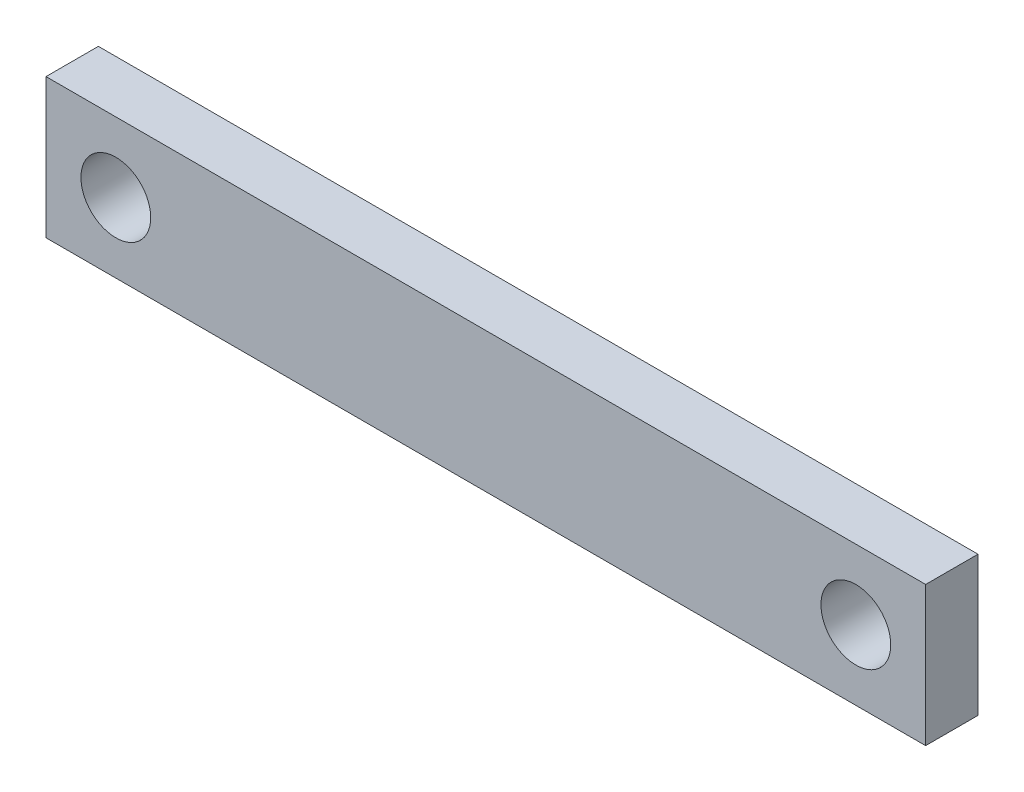
ISO-10303-21;
HEADER;
FILE_DESCRIPTION(('STEP AP214'),'2;1');
FILE_NAME('part.step','',(''),(''),'','','');
FILE_SCHEMA(('AUTOMOTIVE_DESIGN { 1 0 10303 214 1 1 1 1 }'));
ENDSEC;
DATA;
#1=APPLICATION_CONTEXT('core data for automotive mechanical design processes');
#2=APPLICATION_PROTOCOL_DEFINITION('international standard','automotive_design',2000,#1);
#3=PRODUCT_CONTEXT('',#1,'mechanical');
#4=PRODUCT('Part','Part','',(#3));
#5=PRODUCT_RELATED_PRODUCT_CATEGORY('part','',(#4));
#6=PRODUCT_DEFINITION_FORMATION('','',#4);
#7=PRODUCT_DEFINITION_CONTEXT('part definition',#1,'design');
#8=PRODUCT_DEFINITION('design','',#6,#7);
#9=PRODUCT_DEFINITION_SHAPE('','',#8);
#10=(LENGTH_UNIT() NAMED_UNIT(*) SI_UNIT(.MILLI.,.METRE.));
#11=(NAMED_UNIT(*) PLANE_ANGLE_UNIT() SI_UNIT($,.RADIAN.));
#12=(NAMED_UNIT(*) SI_UNIT($,.STERADIAN.) SOLID_ANGLE_UNIT());
#13=UNCERTAINTY_MEASURE_WITH_UNIT(LENGTH_MEASURE(1.E-05),#10,'distance_accuracy_value','');
#14=(GEOMETRIC_REPRESENTATION_CONTEXT(3) GLOBAL_UNCERTAINTY_ASSIGNED_CONTEXT((#13)) GLOBAL_UNIT_ASSIGNED_CONTEXT((#10,
#11,#12)) REPRESENTATION_CONTEXT('',''));
#15=CARTESIAN_POINT('',(0.,0.,0.));
#16=DIRECTION('',(0.,0.,1.));
#17=DIRECTION('',(1.,0.,0.));
#18=AXIS2_PLACEMENT_3D('',#15,#16,#17);
#19=CARTESIAN_POINT('',(0.,0.,9.52499999999999));
#20=DIRECTION('',(0.,0.,-1.));
#21=DIRECTION('',(-1.,0.,0.));
#22=AXIS2_PLACEMENT_3D('',#19,#20,#21);
#23=PLANE('',#22);
#24=CARTESIAN_POINT('',(147.32,12.7000000000001,9.52499999999998));
#25=DIRECTION('',(0.,0.,1.));
#26=DIRECTION('',(1.,0.,0.));
#27=AXIS2_PLACEMENT_3D('',#24,#25,#26);
#28=CIRCLE('',#27,6.34999999999999);
#29=CARTESIAN_POINT('',(153.67,12.7000000000001,9.52499999999998));
#30=VERTEX_POINT('',#29);
#31=EDGE_CURVE('E115',#30,#30,#28,.T.);
#32=ORIENTED_EDGE('',*,*,#31,.F.);
#33=EDGE_LOOP('',(#32));
#34=FACE_BOUND('',#33,.T.);
#35=DIRECTION('',(1.,0.,0.));
#36=VECTOR('',#35,1.);
#37=CARTESIAN_POINT('',(0.,0.,9.52499999999999));
#38=LINE('',#37,#36);
#39=CARTESIAN_POINT('',(0.,0.,9.52499999999999));
#40=VERTEX_POINT('',#39);
#41=CARTESIAN_POINT('',(160.02,0.,9.525));
#42=VERTEX_POINT('',#41);
#43=EDGE_CURVE('E120',#40,#42,#38,.T.);
#44=ORIENTED_EDGE('',*,*,#43,.T.);
#45=DIRECTION('',(0.,-1.,0.));
#46=VECTOR('',#45,1.);
#47=CARTESIAN_POINT('',(160.02,25.4000000000001,9.52499999999996));
#48=LINE('',#47,#46);
#49=CARTESIAN_POINT('',(160.02,25.4000000000001,9.52499999999996));
#50=VERTEX_POINT('',#49);
#51=EDGE_CURVE('E143',#50,#42,#48,.T.);
#52=ORIENTED_EDGE('',*,*,#51,.F.);
#53=DIRECTION('',(-1.,0.,0.));
#54=VECTOR('',#53,1.);
#55=CARTESIAN_POINT('',(0.,25.4000000000001,9.52499999999999));
#56=LINE('',#55,#54);
#57=CARTESIAN_POINT('',(0.,25.4000000000001,9.52499999999999));
#58=VERTEX_POINT('',#57);
#59=EDGE_CURVE('E75',#50,#58,#56,.T.);
#60=ORIENTED_EDGE('',*,*,#59,.T.);
#61=DIRECTION('',(0.,-1.,0.));
#62=VECTOR('',#61,1.);
#63=CARTESIAN_POINT('',(0.,0.,9.52499999999999));
#64=LINE('',#63,#62);
#65=EDGE_CURVE('E96',#58,#40,#64,.T.);
#66=ORIENTED_EDGE('',*,*,#65,.T.);
#67=EDGE_LOOP('',(#44,#52,#60,#66));
#68=FACE_BOUND('',#67,.T.);
#69=CARTESIAN_POINT('',(12.7,12.7000000000001,9.52499999999994));
#70=DIRECTION('',(0.,0.,1.));
#71=DIRECTION('',(1.,0.,0.));
#72=AXIS2_PLACEMENT_3D('',#69,#70,#71);
#73=CIRCLE('',#72,6.35);
#74=CARTESIAN_POINT('',(19.05,12.7000000000001,9.52499999999994));
#75=VERTEX_POINT('',#74);
#76=EDGE_CURVE('E133',#75,#75,#73,.T.);
#77=ORIENTED_EDGE('',*,*,#76,.F.);
#78=EDGE_LOOP('',(#77));
#79=FACE_BOUND('',#78,.T.);
#80=ADVANCED_FACE('F50',(#34,#68,#79),#23,.F.);
#81=CARTESIAN_POINT('',(0.,0.,0.));
#82=DIRECTION('',(0.,0.,-1.));
#83=DIRECTION('',(-1.,0.,0.));
#84=AXIS2_PLACEMENT_3D('',#81,#82,#83);
#85=PLANE('',#84);
#86=DIRECTION('',(0.,-1.,0.));
#87=VECTOR('',#86,1.);
#88=CARTESIAN_POINT('',(160.02,25.4000000000001,0.));
#89=LINE('',#88,#87);
#90=CARTESIAN_POINT('',(160.02,25.4000000000001,0.));
#91=VERTEX_POINT('',#90);
#92=CARTESIAN_POINT('',(160.02,0.,0.));
#93=VERTEX_POINT('',#92);
#94=EDGE_CURVE('E66',#91,#93,#89,.T.);
#95=ORIENTED_EDGE('',*,*,#94,.T.);
#96=DIRECTION('',(1.,0.,0.));
#97=VECTOR('',#96,1.);
#98=CARTESIAN_POINT('',(0.,0.,0.));
#99=LINE('',#98,#97);
#100=CARTESIAN_POINT('',(0.,0.,0.));
#101=VERTEX_POINT('',#100);
#102=EDGE_CURVE('E97',#101,#93,#99,.T.);
#103=ORIENTED_EDGE('',*,*,#102,.F.);
#104=DIRECTION('',(0.,-1.,0.));
#105=VECTOR('',#104,1.);
#106=CARTESIAN_POINT('',(0.,0.,0.));
#107=LINE('',#106,#105);
#108=CARTESIAN_POINT('',(0.,25.4000000000001,0.));
#109=VERTEX_POINT('',#108);
#110=EDGE_CURVE('E102',#109,#101,#107,.T.);
#111=ORIENTED_EDGE('',*,*,#110,.F.);
#112=DIRECTION('',(-1.,0.,0.));
#113=VECTOR('',#112,1.);
#114=CARTESIAN_POINT('',(0.,25.4000000000001,0.));
#115=LINE('',#114,#113);
#116=EDGE_CURVE('E88',#91,#109,#115,.T.);
#117=ORIENTED_EDGE('',*,*,#116,.F.);
#118=EDGE_LOOP('',(#95,#103,#111,#117));
#119=FACE_BOUND('',#118,.T.);
#120=CARTESIAN_POINT('',(147.32,12.7000000000001,0.));
#121=DIRECTION('',(0.,0.,1.));
#122=DIRECTION('',(1.,0.,0.));
#123=AXIS2_PLACEMENT_3D('',#120,#121,#122);
#124=CIRCLE('',#123,6.34999999999999);
#125=CARTESIAN_POINT('',(153.67,12.7000000000001,0.));
#126=VERTEX_POINT('',#125);
#127=EDGE_CURVE('E108',#126,#126,#124,.T.);
#128=ORIENTED_EDGE('',*,*,#127,.T.);
#129=EDGE_LOOP('',(#128));
#130=FACE_BOUND('',#129,.T.);
#131=CARTESIAN_POINT('',(12.7,12.7000000000001,0.));
#132=DIRECTION('',(0.,0.,1.));
#133=DIRECTION('',(1.,0.,0.));
#134=AXIS2_PLACEMENT_3D('',#131,#132,#133);
#135=CIRCLE('',#134,6.35);
#136=CARTESIAN_POINT('',(19.05,12.7000000000001,0.));
#137=VERTEX_POINT('',#136);
#138=EDGE_CURVE('E129',#137,#137,#135,.T.);
#139=ORIENTED_EDGE('',*,*,#138,.T.);
#140=EDGE_LOOP('',(#139));
#141=FACE_BOUND('',#140,.T.);
#142=ADVANCED_FACE('F104',(#119,#130,#141),#85,.T.);
#143=CARTESIAN_POINT('',(0.,0.,9.52499999999999));
#144=DIRECTION('',(1.,0.,0.));
#145=DIRECTION('',(0.,0.,-1.));
#146=AXIS2_PLACEMENT_3D('',#143,#144,#145);
#147=PLANE('',#146);
#148=ORIENTED_EDGE('',*,*,#110,.T.);
#149=DIRECTION('',(0.,0.,-1.));
#150=VECTOR('',#149,1.);
#151=CARTESIAN_POINT('',(0.,0.,9.52499999999999));
#152=LINE('',#151,#150);
#153=EDGE_CURVE('E13',#40,#101,#152,.T.);
#154=ORIENTED_EDGE('',*,*,#153,.F.);
#155=ORIENTED_EDGE('',*,*,#65,.F.);
#156=DIRECTION('',(0.,0.,-1.));
#157=VECTOR('',#156,1.);
#158=CARTESIAN_POINT('',(0.,25.4000000000001,9.52499999999999));
#159=LINE('',#158,#157);
#160=EDGE_CURVE('E59',#58,#109,#159,.T.);
#161=ORIENTED_EDGE('',*,*,#160,.T.);
#162=EDGE_LOOP('',(#148,#154,#155,#161));
#163=FACE_BOUND('',#162,.T.);
#164=ADVANCED_FACE('F52',(#163),#147,.F.);
#165=CARTESIAN_POINT('',(0.,0.,9.52499999999999));
#166=DIRECTION('',(0.,1.,0.));
#167=DIRECTION('',(0.,0.,1.));
#168=AXIS2_PLACEMENT_3D('',#165,#166,#167);
#169=PLANE('',#168);
#170=ORIENTED_EDGE('',*,*,#102,.T.);
#171=DIRECTION('',(0.,0.,1.));
#172=VECTOR('',#171,1.);
#173=CARTESIAN_POINT('',(160.02,0.,0.));
#174=LINE('',#173,#172);
#175=EDGE_CURVE('E137',#93,#42,#174,.T.);
#176=ORIENTED_EDGE('',*,*,#175,.T.);
#177=ORIENTED_EDGE('',*,*,#43,.F.);
#178=ORIENTED_EDGE('',*,*,#153,.T.);
#179=EDGE_LOOP('',(#170,#176,#177,#178));
#180=FACE_BOUND('',#179,.T.);
#181=ADVANCED_FACE('F152',(#180),#169,.F.);
#182=CARTESIAN_POINT('',(0.,25.4000000000001,9.52499999999999));
#183=DIRECTION('',(0.,-1.,0.));
#184=DIRECTION('',(0.,0.,-1.));
#185=AXIS2_PLACEMENT_3D('',#182,#183,#184);
#186=PLANE('',#185);
#187=ORIENTED_EDGE('',*,*,#59,.F.);
#188=DIRECTION('',(0.,0.,1.));
#189=VECTOR('',#188,1.);
#190=CARTESIAN_POINT('',(160.02,25.4000000000001,0.));
#191=LINE('',#190,#189);
#192=EDGE_CURVE('E92',#91,#50,#191,.T.);
#193=ORIENTED_EDGE('',*,*,#192,.F.);
#194=ORIENTED_EDGE('',*,*,#116,.T.);
#195=ORIENTED_EDGE('',*,*,#160,.F.);
#196=EDGE_LOOP('',(#187,#193,#194,#195));
#197=FACE_BOUND('',#196,.T.);
#198=ADVANCED_FACE('F90',(#197),#186,.F.);
#199=CARTESIAN_POINT('',(147.32,12.7000000000001,9.52499999999998));
#200=DIRECTION('',(0.,0.,1.));
#201=DIRECTION('',(1.,0.,0.));
#202=AXIS2_PLACEMENT_3D('',#199,#200,#201);
#203=CYLINDRICAL_SURFACE('',#202,6.34999999999999);
#204=ORIENTED_EDGE('',*,*,#127,.F.);
#205=EDGE_LOOP('',(#204));
#206=FACE_BOUND('',#205,.T.);
#207=ORIENTED_EDGE('',*,*,#31,.T.);
#208=EDGE_LOOP('',(#207));
#209=FACE_BOUND('',#208,.T.);
#210=ADVANCED_FACE('F162',(#206,#209),#203,.F.);
#211=CARTESIAN_POINT('',(12.7,12.7000000000001,9.52499999999994));
#212=DIRECTION('',(0.,0.,1.));
#213=DIRECTION('',(1.,0.,0.));
#214=AXIS2_PLACEMENT_3D('',#211,#212,#213);
#215=CYLINDRICAL_SURFACE('',#214,6.35);
#216=ORIENTED_EDGE('',*,*,#138,.F.);
#217=EDGE_LOOP('',(#216));
#218=FACE_BOUND('',#217,.T.);
#219=ORIENTED_EDGE('',*,*,#76,.T.);
#220=EDGE_LOOP('',(#219));
#221=FACE_BOUND('',#220,.T.);
#222=ADVANCED_FACE('F159',(#218,#221),#215,.F.);
#223=CARTESIAN_POINT('',(160.02,25.4000000000001,0.));
#224=DIRECTION('',(-1.,0.,0.));
#225=DIRECTION('',(0.,0.,1.));
#226=AXIS2_PLACEMENT_3D('',#223,#224,#225);
#227=PLANE('',#226);
#228=ORIENTED_EDGE('',*,*,#51,.T.);
#229=ORIENTED_EDGE('',*,*,#175,.F.);
#230=ORIENTED_EDGE('',*,*,#94,.F.);
#231=ORIENTED_EDGE('',*,*,#192,.T.);
#232=EDGE_LOOP('',(#228,#229,#230,#231));
#233=FACE_BOUND('',#232,.T.);
#234=ADVANCED_FACE('F161',(#233),#227,.F.);
#235=CLOSED_SHELL('',(#80,#142,#164,#181,#198,#210,#222,#234));
#236=MANIFOLD_SOLID_BREP('B2',#235);
#237=ADVANCED_BREP_SHAPE_REPRESENTATION('',(#18,#236),#14);
#238=SHAPE_DEFINITION_REPRESENTATION(#9,#237);
ENDSEC;
END-ISO-10303-21;
